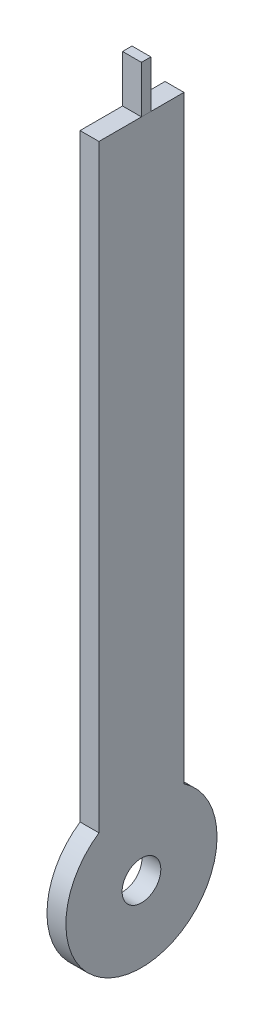
ISO-10303-21;
HEADER;
FILE_DESCRIPTION(('STEP AP214'),'2;1');
FILE_NAME('part.step','',(''),(''),'','','');
FILE_SCHEMA(('AUTOMOTIVE_DESIGN { 1 0 10303 214 1 1 1 1 }'));
ENDSEC;
DATA;
#1=APPLICATION_CONTEXT('core data for automotive mechanical design processes');
#2=APPLICATION_PROTOCOL_DEFINITION('international standard','automotive_design',2000,#1);
#3=PRODUCT_CONTEXT('',#1,'mechanical');
#4=PRODUCT('Part','Part','',(#3));
#5=PRODUCT_RELATED_PRODUCT_CATEGORY('part','',(#4));
#6=PRODUCT_DEFINITION_FORMATION('','',#4);
#7=PRODUCT_DEFINITION_CONTEXT('part definition',#1,'design');
#8=PRODUCT_DEFINITION('design','',#6,#7);
#9=PRODUCT_DEFINITION_SHAPE('','',#8);
#10=(LENGTH_UNIT() NAMED_UNIT(*) SI_UNIT(.MILLI.,.METRE.));
#11=(NAMED_UNIT(*) PLANE_ANGLE_UNIT() SI_UNIT($,.RADIAN.));
#12=(NAMED_UNIT(*) SI_UNIT($,.STERADIAN.) SOLID_ANGLE_UNIT());
#13=UNCERTAINTY_MEASURE_WITH_UNIT(LENGTH_MEASURE(1.E-05),#10,'distance_accuracy_value','');
#14=(GEOMETRIC_REPRESENTATION_CONTEXT(3) GLOBAL_UNCERTAINTY_ASSIGNED_CONTEXT((#13)) GLOBAL_UNIT_ASSIGNED_CONTEXT((#10,
#11,#12)) REPRESENTATION_CONTEXT('',''));
#15=CARTESIAN_POINT('',(0.,0.,0.));
#16=DIRECTION('',(0.,0.,1.));
#17=DIRECTION('',(1.,0.,0.));
#18=AXIS2_PLACEMENT_3D('',#15,#16,#17);
#19=CARTESIAN_POINT('',(0.,-5.,15.));
#20=DIRECTION('',(0.,0.,1.));
#21=DIRECTION('',(1.,0.,0.));
#22=AXIS2_PLACEMENT_3D('',#19,#20,#21);
#23=PLANE('',#22);
#24=DIRECTION('',(1.,0.,0.));
#25=VECTOR('',#24,1.);
#26=CARTESIAN_POINT('',(-2.,-61.771243444677,15.));
#27=LINE('',#26,#25);
#28=CARTESIAN_POINT('',(2.,-61.771243444677,15.));
#29=VERTEX_POINT('',#28);
#30=CARTESIAN_POINT('',(-2.,-61.771243444677,15.));
#31=VERTEX_POINT('',#30);
#32=EDGE_CURVE('P0_E72',#29,#31,#27,.F.);
#33=ORIENTED_EDGE('',*,*,#32,.F.);
#34=DIRECTION('',(0.,-1.,0.));
#35=VECTOR('',#34,1.);
#36=CARTESIAN_POINT('',(2.,-5.,15.));
#37=LINE('',#36,#35);
#38=CARTESIAN_POINT('',(2.,65.,15.));
#39=VERTEX_POINT('',#38);
#40=EDGE_CURVE('P0_E77',#39,#29,#37,.T.);
#41=ORIENTED_EDGE('',*,*,#40,.F.);
#42=DIRECTION('',(1.,0.,0.));
#43=VECTOR('',#42,1.);
#44=CARTESIAN_POINT('',(0.,65.,15.));
#45=LINE('',#44,#43);
#46=CARTESIAN_POINT('',(-2.,65.,15.));
#47=VERTEX_POINT('',#46);
#48=EDGE_CURVE('P0_E25',#47,#39,#45,.T.);
#49=ORIENTED_EDGE('',*,*,#48,.F.);
#50=DIRECTION('',(0.,1.,0.));
#51=VECTOR('',#50,1.);
#52=CARTESIAN_POINT('',(-2.,-5.,15.));
#53=LINE('',#52,#51);
#54=EDGE_CURVE('P0_E11',#31,#47,#53,.T.);
#55=ORIENTED_EDGE('',*,*,#54,.F.);
#56=EDGE_LOOP('',(#33,#41,#49,#55));
#57=FACE_BOUND('',#56,.T.);
#58=ADVANCED_FACE('P0_F17',(#57),#23,.T.);
#59=CARTESIAN_POINT('',(-2.,-5.,-3.));
#60=DIRECTION('',(-1.,0.,0.));
#61=DIRECTION('',(0.,0.,1.));
#62=AXIS2_PLACEMENT_3D('',#59,#60,#61);
#63=PLANE('',#62);
#64=CARTESIAN_POINT('',(-2.,-75.,6.));
#65=DIRECTION('',(-1.,0.,0.));
#66=DIRECTION('',(0.,0.,1.));
#67=AXIS2_PLACEMENT_3D('',#64,#65,#66);
#68=CIRCLE('',#67,4.1);
#69=CARTESIAN_POINT('',(-2.,-75.,10.1));
#70=VERTEX_POINT('',#69);
#71=EDGE_CURVE('P0_E79',#70,#70,#68,.T.);
#72=ORIENTED_EDGE('',*,*,#71,.F.);
#73=EDGE_LOOP('',(#72));
#74=FACE_BOUND('',#73,.T.);
#75=CARTESIAN_POINT('',(-2.,-75.,6.));
#76=DIRECTION('',(1.,0.,0.));
#77=DIRECTION('',(0.,0.,-1.));
#78=AXIS2_PLACEMENT_3D('',#75,#76,#77);
#79=CIRCLE('',#78,16.);
#80=CARTESIAN_POINT('',(-2.,-61.771243444677,-3.));
#81=VERTEX_POINT('',#80);
#82=EDGE_CURVE('P0_E71',#31,#81,#79,.T.);
#83=ORIENTED_EDGE('',*,*,#82,.F.);
#84=ORIENTED_EDGE('',*,*,#54,.T.);
#85=DIRECTION('',(0.,0.,1.));
#86=VECTOR('',#85,1.);
#87=CARTESIAN_POINT('',(-2.,65.,-3.));
#88=LINE('',#87,#86);
#89=CARTESIAN_POINT('',(-2.,65.,-3.));
#90=VERTEX_POINT('',#89);
#91=EDGE_CURVE('P0_E88',#90,#47,#88,.T.);
#92=ORIENTED_EDGE('',*,*,#91,.F.);
#93=DIRECTION('',(0.,-1.,0.));
#94=VECTOR('',#93,1.);
#95=CARTESIAN_POINT('',(-2.,-5.,-3.));
#96=LINE('',#95,#94);
#97=EDGE_CURVE('P0_E83',#90,#81,#96,.T.);
#98=ORIENTED_EDGE('',*,*,#97,.T.);
#99=EDGE_LOOP('',(#83,#84,#92,#98));
#100=FACE_BOUND('',#99,.T.);
#101=ADVANCED_FACE('P0_F95',(#74,#100),#63,.T.);
#102=CARTESIAN_POINT('',(0.,65.,-3.));
#103=DIRECTION('',(0.,1.,0.));
#104=DIRECTION('',(0.,0.,1.));
#105=AXIS2_PLACEMENT_3D('',#102,#103,#104);
#106=PLANE('',#105);
#107=ORIENTED_EDGE('',*,*,#91,.T.);
#108=ORIENTED_EDGE('',*,*,#48,.T.);
#109=DIRECTION('',(0.,0.,1.));
#110=VECTOR('',#109,1.);
#111=CARTESIAN_POINT('',(2.,65.,-3.));
#112=LINE('',#111,#110);
#113=CARTESIAN_POINT('',(2.,65.,-3.));
#114=VERTEX_POINT('',#113);
#115=EDGE_CURVE('P0_E63',#114,#39,#112,.T.);
#116=ORIENTED_EDGE('',*,*,#115,.F.);
#117=DIRECTION('',(-1.,0.,0.));
#118=VECTOR('',#117,1.);
#119=CARTESIAN_POINT('',(0.,65.,-3.));
#120=LINE('',#119,#118);
#121=EDGE_CURVE('P0_E58',#114,#90,#120,.T.);
#122=ORIENTED_EDGE('',*,*,#121,.T.);
#123=EDGE_LOOP('',(#107,#108,#116,#122));
#124=FACE_BOUND('',#123,.T.);
#125=ADVANCED_FACE('P0_F93',(#124),#106,.T.);
#126=CARTESIAN_POINT('',(0.,-5.,-3.));
#127=DIRECTION('',(0.,0.,-1.));
#128=DIRECTION('',(-1.,0.,0.));
#129=AXIS2_PLACEMENT_3D('',#126,#127,#128);
#130=PLANE('',#129);
#131=DIRECTION('',(1.,0.,0.));
#132=VECTOR('',#131,1.);
#133=CARTESIAN_POINT('',(-2.,-61.771243444677,-3.));
#134=LINE('',#133,#132);
#135=CARTESIAN_POINT('',(2.,-61.771243444677,-3.));
#136=VERTEX_POINT('',#135);
#137=EDGE_CURVE('P0_E38',#81,#136,#134,.T.);
#138=ORIENTED_EDGE('',*,*,#137,.F.);
#139=ORIENTED_EDGE('',*,*,#97,.F.);
#140=ORIENTED_EDGE('',*,*,#121,.F.);
#141=DIRECTION('',(0.,1.,0.));
#142=VECTOR('',#141,1.);
#143=CARTESIAN_POINT('',(2.,-5.,-3.));
#144=LINE('',#143,#142);
#145=EDGE_CURVE('P0_E55',#136,#114,#144,.T.);
#146=ORIENTED_EDGE('',*,*,#145,.F.);
#147=EDGE_LOOP('',(#138,#139,#140,#146));
#148=FACE_BOUND('',#147,.T.);
#149=ADVANCED_FACE('P0_F56',(#148),#130,.T.);
#150=CARTESIAN_POINT('',(2.,-5.,-3.));
#151=DIRECTION('',(1.,0.,0.));
#152=DIRECTION('',(0.,0.,-1.));
#153=AXIS2_PLACEMENT_3D('',#150,#151,#152);
#154=PLANE('',#153);
#155=CARTESIAN_POINT('',(2.,-75.,6.));
#156=DIRECTION('',(1.,0.,0.));
#157=DIRECTION('',(0.,0.,-1.));
#158=AXIS2_PLACEMENT_3D('',#155,#156,#157);
#159=CIRCLE('',#158,4.1);
#160=CARTESIAN_POINT('',(2.,-75.,1.9));
#161=VERTEX_POINT('',#160);
#162=EDGE_CURVE('P0_E20',#161,#161,#159,.T.);
#163=ORIENTED_EDGE('',*,*,#162,.F.);
#164=EDGE_LOOP('',(#163));
#165=FACE_BOUND('',#164,.T.);
#166=ORIENTED_EDGE('',*,*,#40,.T.);
#167=CARTESIAN_POINT('',(2.,-75.,6.));
#168=DIRECTION('',(-1.,0.,0.));
#169=DIRECTION('',(0.,0.,1.));
#170=AXIS2_PLACEMENT_3D('',#167,#168,#169);
#171=CIRCLE('',#170,16.);
#172=EDGE_CURVE('P0_E69',#136,#29,#171,.T.);
#173=ORIENTED_EDGE('',*,*,#172,.F.);
#174=ORIENTED_EDGE('',*,*,#145,.T.);
#175=ORIENTED_EDGE('',*,*,#115,.T.);
#176=EDGE_LOOP('',(#166,#173,#174,#175));
#177=FACE_BOUND('',#176,.T.);
#178=ADVANCED_FACE('P0_F75',(#165,#177),#154,.T.);
#179=CARTESIAN_POINT('',(-2.,-75.,6.));
#180=DIRECTION('',(1.,0.,0.));
#181=DIRECTION('',(0.,0.,-1.));
#182=AXIS2_PLACEMENT_3D('',#179,#180,#181);
#183=CYLINDRICAL_SURFACE('',#182,16.);
#184=ORIENTED_EDGE('',*,*,#172,.T.);
#185=ORIENTED_EDGE('',*,*,#32,.T.);
#186=ORIENTED_EDGE('',*,*,#82,.T.);
#187=ORIENTED_EDGE('',*,*,#137,.T.);
#188=EDGE_LOOP('',(#184,#185,#186,#187));
#189=FACE_BOUND('',#188,.T.);
#190=ADVANCED_FACE('P0_F68',(#189),#183,.T.);
#191=CARTESIAN_POINT('',(-2.3,-75.,6.));
#192=DIRECTION('',(1.,0.,0.));
#193=DIRECTION('',(0.,0.,-1.));
#194=AXIS2_PLACEMENT_3D('',#191,#192,#193);
#195=CYLINDRICAL_SURFACE('',#194,4.1);
#196=ORIENTED_EDGE('',*,*,#71,.T.);
#197=EDGE_LOOP('',(#196));
#198=FACE_BOUND('',#197,.T.);
#199=ORIENTED_EDGE('',*,*,#162,.T.);
#200=EDGE_LOOP('',(#199));
#201=FACE_BOUND('',#200,.T.);
#202=ADVANCED_FACE('P0_F113',(#198,#201),#195,.F.);
#203=CLOSED_SHELL('',(#58,#101,#125,#149,#178,#190,#202));
#204=MANIFOLD_SOLID_BREP('P0_B1',#203);
#205=CARTESIAN_POINT('',(0.,70.,6.));
#206=DIRECTION('',(0.,0.,1.));
#207=DIRECTION('',(1.,0.,0.));
#208=AXIS2_PLACEMENT_3D('',#205,#206,#207);
#209=PLANE('',#208);
#210=DIRECTION('',(-1.,0.,0.));
#211=VECTOR('',#210,1.);
#212=CARTESIAN_POINT('',(0.,65.,6.));
#213=LINE('',#212,#211);
#214=CARTESIAN_POINT('',(2.,65.,6.));
#215=VERTEX_POINT('',#214);
#216=CARTESIAN_POINT('',(-2.,65.,6.));
#217=VERTEX_POINT('',#216);
#218=EDGE_CURVE('P1_E10',#215,#217,#213,.T.);
#219=ORIENTED_EDGE('',*,*,#218,.F.);
#220=DIRECTION('',(0.,-1.,0.));
#221=VECTOR('',#220,1.);
#222=CARTESIAN_POINT('',(2.,70.,6.));
#223=LINE('',#222,#221);
#224=CARTESIAN_POINT('',(2.,75.,6.));
#225=VERTEX_POINT('',#224);
#226=EDGE_CURVE('P1_E60',#225,#215,#223,.T.);
#227=ORIENTED_EDGE('',*,*,#226,.F.);
#228=DIRECTION('',(1.,0.,0.));
#229=VECTOR('',#228,1.);
#230=CARTESIAN_POINT('',(0.,75.,6.));
#231=LINE('',#230,#229);
#232=CARTESIAN_POINT('',(-2.,75.,6.));
#233=VERTEX_POINT('',#232);
#234=EDGE_CURVE('P1_E86',#233,#225,#231,.T.);
#235=ORIENTED_EDGE('',*,*,#234,.F.);
#236=DIRECTION('',(0.,1.,0.));
#237=VECTOR('',#236,1.);
#238=CARTESIAN_POINT('',(-2.,70.,6.));
#239=LINE('',#238,#237);
#240=EDGE_CURVE('P1_E23',#217,#233,#239,.T.);
#241=ORIENTED_EDGE('',*,*,#240,.F.);
#242=EDGE_LOOP('',(#219,#227,#235,#241));
#243=FACE_BOUND('',#242,.T.);
#244=ADVANCED_FACE('P1_F16',(#243),#209,.T.);
#245=CARTESIAN_POINT('',(0.,65.,4.));
#246=DIRECTION('',(0.,-1.,0.));
#247=DIRECTION('',(0.,0.,-1.));
#248=AXIS2_PLACEMENT_3D('',#245,#246,#247);
#249=PLANE('',#248);
#250=DIRECTION('',(0.,0.,1.));
#251=VECTOR('',#250,1.);
#252=CARTESIAN_POINT('',(2.,65.,4.));
#253=LINE('',#252,#251);
#254=CARTESIAN_POINT('',(2.,65.,4.));
#255=VERTEX_POINT('',#254);
#256=EDGE_CURVE('P1_E53',#255,#215,#253,.T.);
#257=ORIENTED_EDGE('',*,*,#256,.T.);
#258=ORIENTED_EDGE('',*,*,#218,.T.);
#259=DIRECTION('',(0.,0.,1.));
#260=VECTOR('',#259,1.);
#261=CARTESIAN_POINT('',(-2.,65.,4.));
#262=LINE('',#261,#260);
#263=CARTESIAN_POINT('',(-2.,65.,4.));
#264=VERTEX_POINT('',#263);
#265=EDGE_CURVE('P1_E66',#264,#217,#262,.T.);
#266=ORIENTED_EDGE('',*,*,#265,.F.);
#267=DIRECTION('',(1.,0.,0.));
#268=VECTOR('',#267,1.);
#269=CARTESIAN_POINT('',(0.,65.,4.));
#270=LINE('',#269,#268);
#271=EDGE_CURVE('P1_E64',#264,#255,#270,.T.);
#272=ORIENTED_EDGE('',*,*,#271,.T.);
#273=EDGE_LOOP('',(#257,#258,#266,#272));
#274=FACE_BOUND('',#273,.T.);
#275=ADVANCED_FACE('P1_F65',(#274),#249,.T.);
#276=CARTESIAN_POINT('',(-2.,70.,4.));
#277=DIRECTION('',(-1.,0.,0.));
#278=DIRECTION('',(0.,0.,1.));
#279=AXIS2_PLACEMENT_3D('',#276,#277,#278);
#280=PLANE('',#279);
#281=ORIENTED_EDGE('',*,*,#265,.T.);
#282=ORIENTED_EDGE('',*,*,#240,.T.);
#283=DIRECTION('',(0.,0.,1.));
#284=VECTOR('',#283,1.);
#285=CARTESIAN_POINT('',(-2.,75.,4.));
#286=LINE('',#285,#284);
#287=CARTESIAN_POINT('',(-2.,75.,4.));
#288=VERTEX_POINT('',#287);
#289=EDGE_CURVE('P1_E81',#288,#233,#286,.T.);
#290=ORIENTED_EDGE('',*,*,#289,.F.);
#291=DIRECTION('',(0.,-1.,0.));
#292=VECTOR('',#291,1.);
#293=CARTESIAN_POINT('',(-2.,70.,4.));
#294=LINE('',#293,#292);
#295=EDGE_CURVE('P1_E70',#288,#264,#294,.T.);
#296=ORIENTED_EDGE('',*,*,#295,.T.);
#297=EDGE_LOOP('',(#281,#282,#290,#296));
#298=FACE_BOUND('',#297,.T.);
#299=ADVANCED_FACE('P1_F90',(#298),#280,.T.);
#300=CARTESIAN_POINT('',(0.,75.,4.));
#301=DIRECTION('',(0.,1.,0.));
#302=DIRECTION('',(0.,0.,1.));
#303=AXIS2_PLACEMENT_3D('',#300,#301,#302);
#304=PLANE('',#303);
#305=ORIENTED_EDGE('',*,*,#289,.T.);
#306=ORIENTED_EDGE('',*,*,#234,.T.);
#307=DIRECTION('',(0.,0.,1.));
#308=VECTOR('',#307,1.);
#309=CARTESIAN_POINT('',(2.,75.,4.));
#310=LINE('',#309,#308);
#311=CARTESIAN_POINT('',(2.,75.,4.));
#312=VERTEX_POINT('',#311);
#313=EDGE_CURVE('P1_E61',#312,#225,#310,.T.);
#314=ORIENTED_EDGE('',*,*,#313,.F.);
#315=DIRECTION('',(-1.,0.,0.));
#316=VECTOR('',#315,1.);
#317=CARTESIAN_POINT('',(0.,75.,4.));
#318=LINE('',#317,#316);
#319=EDGE_CURVE('P1_E75',#312,#288,#318,.T.);
#320=ORIENTED_EDGE('',*,*,#319,.T.);
#321=EDGE_LOOP('',(#305,#306,#314,#320));
#322=FACE_BOUND('',#321,.T.);
#323=ADVANCED_FACE('P1_F88',(#322),#304,.T.);
#324=CARTESIAN_POINT('',(0.,70.,4.));
#325=DIRECTION('',(0.,0.,-1.));
#326=DIRECTION('',(-1.,0.,0.));
#327=AXIS2_PLACEMENT_3D('',#324,#325,#326);
#328=PLANE('',#327);
#329=DIRECTION('',(0.,1.,0.));
#330=VECTOR('',#329,1.);
#331=CARTESIAN_POINT('',(2.,70.,4.));
#332=LINE('',#331,#330);
#333=EDGE_CURVE('P1_E58',#255,#312,#332,.T.);
#334=ORIENTED_EDGE('',*,*,#333,.F.);
#335=ORIENTED_EDGE('',*,*,#271,.F.);
#336=ORIENTED_EDGE('',*,*,#295,.F.);
#337=ORIENTED_EDGE('',*,*,#319,.F.);
#338=EDGE_LOOP('',(#334,#335,#336,#337));
#339=FACE_BOUND('',#338,.T.);
#340=ADVANCED_FACE('P1_F73',(#339),#328,.T.);
#341=CARTESIAN_POINT('',(2.,70.,4.));
#342=DIRECTION('',(1.,0.,0.));
#343=DIRECTION('',(0.,0.,-1.));
#344=AXIS2_PLACEMENT_3D('',#341,#342,#343);
#345=PLANE('',#344);
#346=ORIENTED_EDGE('',*,*,#333,.T.);
#347=ORIENTED_EDGE('',*,*,#313,.T.);
#348=ORIENTED_EDGE('',*,*,#226,.T.);
#349=ORIENTED_EDGE('',*,*,#256,.F.);
#350=EDGE_LOOP('',(#346,#347,#348,#349));
#351=FACE_BOUND('',#350,.T.);
#352=ADVANCED_FACE('P1_F55',(#351),#345,.T.);
#353=CLOSED_SHELL('',(#244,#275,#299,#323,#340,#352));
#354=MANIFOLD_SOLID_BREP('P1_B1',#353);
#355=ADVANCED_BREP_SHAPE_REPRESENTATION('',(#18,#204,#354),#14);
#356=SHAPE_DEFINITION_REPRESENTATION(#9,#355);
ENDSEC;
END-ISO-10303-21;
